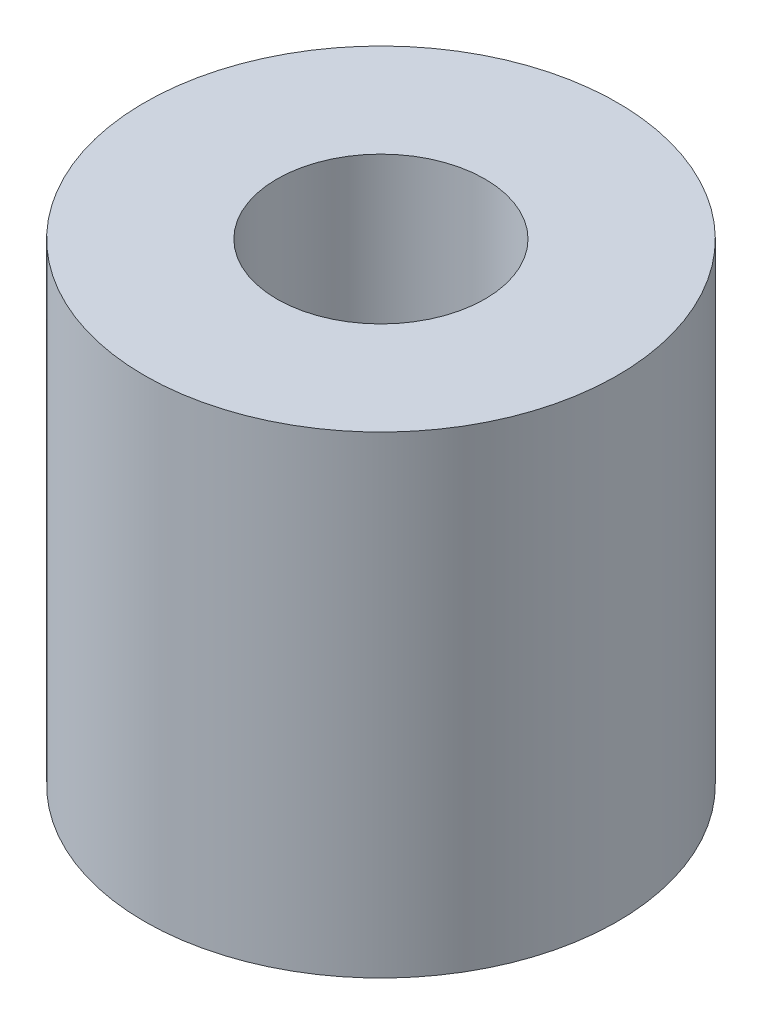
ISO-10303-21;
HEADER;
FILE_DESCRIPTION(('STEP AP214'),'2;1');
FILE_NAME('part.step','',(''),(''),'','','');
FILE_SCHEMA(('AUTOMOTIVE_DESIGN { 1 0 10303 214 1 1 1 1 }'));
ENDSEC;
DATA;
#1=APPLICATION_CONTEXT('core data for automotive mechanical design processes');
#2=APPLICATION_PROTOCOL_DEFINITION('international standard','automotive_design',2000,#1);
#3=PRODUCT_CONTEXT('',#1,'mechanical');
#4=PRODUCT('Part','Part','',(#3));
#5=PRODUCT_RELATED_PRODUCT_CATEGORY('part','',(#4));
#6=PRODUCT_DEFINITION_FORMATION('','',#4);
#7=PRODUCT_DEFINITION_CONTEXT('part definition',#1,'design');
#8=PRODUCT_DEFINITION('design','',#6,#7);
#9=PRODUCT_DEFINITION_SHAPE('','',#8);
#10=(LENGTH_UNIT() NAMED_UNIT(*) SI_UNIT(.MILLI.,.METRE.));
#11=(NAMED_UNIT(*) PLANE_ANGLE_UNIT() SI_UNIT($,.RADIAN.));
#12=(NAMED_UNIT(*) SI_UNIT($,.STERADIAN.) SOLID_ANGLE_UNIT());
#13=UNCERTAINTY_MEASURE_WITH_UNIT(LENGTH_MEASURE(1.E-05),#10,'distance_accuracy_value','');
#14=(GEOMETRIC_REPRESENTATION_CONTEXT(3) GLOBAL_UNCERTAINTY_ASSIGNED_CONTEXT((#13)) GLOBAL_UNIT_ASSIGNED_CONTEXT((#10,
#11,#12)) REPRESENTATION_CONTEXT('',''));
#15=CARTESIAN_POINT('',(0.,0.,0.));
#16=DIRECTION('',(0.,0.,1.));
#17=DIRECTION('',(1.,0.,0.));
#18=AXIS2_PLACEMENT_3D('',#15,#16,#17);
#19=CARTESIAN_POINT('',(0.,5.,0.));
#20=DIRECTION('',(0.,1.,0.));
#21=DIRECTION('',(0.,0.,1.));
#22=AXIS2_PLACEMENT_3D('',#19,#20,#21);
#23=PLANE('',#22);
#24=CARTESIAN_POINT('',(0.,5.,0.));
#25=DIRECTION('',(0.,1.,0.));
#26=DIRECTION('',(0.,0.,1.));
#27=AXIS2_PLACEMENT_3D('',#24,#25,#26);
#28=CIRCLE('',#27,2.5);
#29=CARTESIAN_POINT('',(0.,5.,2.5));
#30=VERTEX_POINT('',#29);
#31=EDGE_CURVE('E10',#30,#30,#28,.T.);
#32=ORIENTED_EDGE('',*,*,#31,.T.);
#33=EDGE_LOOP('',(#32));
#34=FACE_BOUND('',#33,.T.);
#35=CARTESIAN_POINT('',(0.,5.,0.));
#36=DIRECTION('',(0.,1.,0.));
#37=DIRECTION('',(0.,0.,1.));
#38=AXIS2_PLACEMENT_3D('',#35,#36,#37);
#39=CIRCLE('',#38,1.1);
#40=CARTESIAN_POINT('',(0.,5.,1.1));
#41=VERTEX_POINT('',#40);
#42=EDGE_CURVE('E44',#41,#41,#39,.T.);
#43=ORIENTED_EDGE('',*,*,#42,.F.);
#44=EDGE_LOOP('',(#43));
#45=FACE_BOUND('',#44,.T.);
#46=ADVANCED_FACE('F33',(#34,#45),#23,.T.);
#47=CARTESIAN_POINT('',(0.,0.,0.));
#48=DIRECTION('',(0.,1.,0.));
#49=DIRECTION('',(0.,0.,1.));
#50=AXIS2_PLACEMENT_3D('',#47,#48,#49);
#51=PLANE('',#50);
#52=CARTESIAN_POINT('',(0.,0.,0.));
#53=DIRECTION('',(0.,1.,0.));
#54=DIRECTION('',(0.,0.,1.));
#55=AXIS2_PLACEMENT_3D('',#52,#53,#54);
#56=CIRCLE('',#55,2.5);
#57=CARTESIAN_POINT('',(0.,0.,2.5));
#58=VERTEX_POINT('',#57);
#59=EDGE_CURVE('E37',#58,#58,#56,.T.);
#60=ORIENTED_EDGE('',*,*,#59,.F.);
#61=EDGE_LOOP('',(#60));
#62=FACE_BOUND('',#61,.T.);
#63=CARTESIAN_POINT('',(0.,0.,0.));
#64=DIRECTION('',(0.,1.,0.));
#65=DIRECTION('',(0.,0.,1.));
#66=AXIS2_PLACEMENT_3D('',#63,#64,#65);
#67=CIRCLE('',#66,1.1);
#68=CARTESIAN_POINT('',(0.,0.,1.1));
#69=VERTEX_POINT('',#68);
#70=EDGE_CURVE('E46',#69,#69,#67,.T.);
#71=ORIENTED_EDGE('',*,*,#70,.T.);
#72=EDGE_LOOP('',(#71));
#73=FACE_BOUND('',#72,.T.);
#74=ADVANCED_FACE('F56',(#62,#73),#51,.F.);
#75=CARTESIAN_POINT('',(0.,5.,0.));
#76=DIRECTION('',(0.,-1.,0.));
#77=DIRECTION('',(0.,0.,-1.));
#78=AXIS2_PLACEMENT_3D('',#75,#76,#77);
#79=CYLINDRICAL_SURFACE('',#78,2.5);
#80=ORIENTED_EDGE('',*,*,#31,.F.);
#81=EDGE_LOOP('',(#80));
#82=FACE_BOUND('',#81,.T.);
#83=ORIENTED_EDGE('',*,*,#59,.T.);
#84=EDGE_LOOP('',(#83));
#85=FACE_BOUND('',#84,.T.);
#86=ADVANCED_FACE('F35',(#82,#85),#79,.T.);
#87=CARTESIAN_POINT('',(0.,5.,0.));
#88=DIRECTION('',(0.,-1.,0.));
#89=DIRECTION('',(0.,0.,-1.));
#90=AXIS2_PLACEMENT_3D('',#87,#88,#89);
#91=CYLINDRICAL_SURFACE('',#90,1.1);
#92=ORIENTED_EDGE('',*,*,#42,.T.);
#93=EDGE_LOOP('',(#92));
#94=FACE_BOUND('',#93,.T.);
#95=ORIENTED_EDGE('',*,*,#70,.F.);
#96=EDGE_LOOP('',(#95));
#97=FACE_BOUND('',#96,.T.);
#98=ADVANCED_FACE('F52',(#94,#97),#91,.F.);
#99=CLOSED_SHELL('',(#46,#74,#86,#98));
#100=MANIFOLD_SOLID_BREP('B2',#99);
#101=ADVANCED_BREP_SHAPE_REPRESENTATION('',(#18,#100),#14);
#102=SHAPE_DEFINITION_REPRESENTATION(#9,#101);
ENDSEC;
END-ISO-10303-21;
